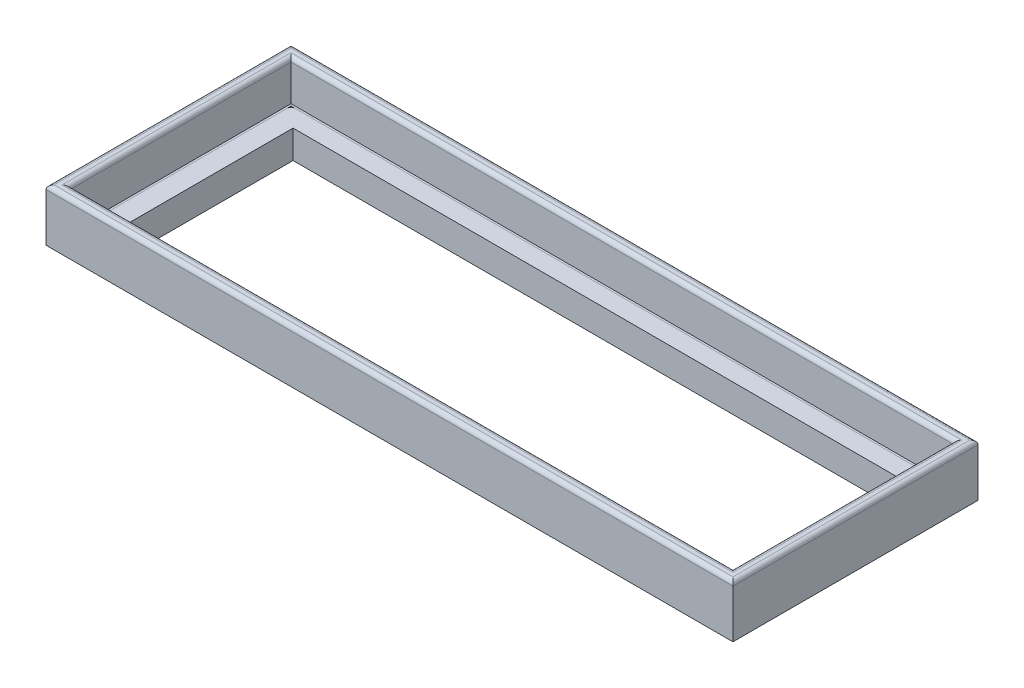
ISO-10303-21;
HEADER;
FILE_DESCRIPTION(('STEP AP214'),'2;1');
FILE_NAME('part.step','',(''),(''),'','','');
FILE_SCHEMA(('AUTOMOTIVE_DESIGN { 1 0 10303 214 1 1 1 1 }'));
ENDSEC;
DATA;
#1=APPLICATION_CONTEXT('core data for automotive mechanical design processes');
#2=APPLICATION_PROTOCOL_DEFINITION('international standard','automotive_design',2000,#1);
#3=PRODUCT_CONTEXT('',#1,'mechanical');
#4=PRODUCT('Part','Part','',(#3));
#5=PRODUCT_RELATED_PRODUCT_CATEGORY('part','',(#4));
#6=PRODUCT_DEFINITION_FORMATION('','',#4);
#7=PRODUCT_DEFINITION_CONTEXT('part definition',#1,'design');
#8=PRODUCT_DEFINITION('design','',#6,#7);
#9=PRODUCT_DEFINITION_SHAPE('','',#8);
#10=(LENGTH_UNIT() NAMED_UNIT(*) SI_UNIT(.MILLI.,.METRE.));
#11=(NAMED_UNIT(*) PLANE_ANGLE_UNIT() SI_UNIT($,.RADIAN.));
#12=(NAMED_UNIT(*) SI_UNIT($,.STERADIAN.) SOLID_ANGLE_UNIT());
#13=UNCERTAINTY_MEASURE_WITH_UNIT(LENGTH_MEASURE(1.E-05),#10,'distance_accuracy_value','');
#14=(GEOMETRIC_REPRESENTATION_CONTEXT(3) GLOBAL_UNCERTAINTY_ASSIGNED_CONTEXT((#13)) GLOBAL_UNIT_ASSIGNED_CONTEXT((#10,
#11,#12)) REPRESENTATION_CONTEXT('',''));
#15=CARTESIAN_POINT('',(0.,0.,0.));
#16=DIRECTION('',(0.,0.,1.));
#17=DIRECTION('',(1.,0.,0.));
#18=AXIS2_PLACEMENT_3D('',#15,#16,#17);
#19=CARTESIAN_POINT('',(-82.,-7.,27.));
#20=DIRECTION('',(1.,0.,0.));
#21=DIRECTION('',(0.,0.,-1.));
#22=AXIS2_PLACEMENT_3D('',#19,#20,#21);
#23=PLANE('',#22);
#24=DIRECTION('',(0.,1.,0.));
#25=VECTOR('',#24,1.);
#26=CARTESIAN_POINT('',(-82.,-7.,27.));
#27=LINE('',#26,#25);
#28=CARTESIAN_POINT('',(-82.,-6.,27.));
#29=VERTEX_POINT('',#28);
#30=CARTESIAN_POINT('',(-82.,-1.,27.));
#31=VERTEX_POINT('',#30);
#32=EDGE_CURVE('E194',#29,#31,#27,.T.);
#33=ORIENTED_EDGE('',*,*,#32,.T.);
#34=CARTESIAN_POINT('',(-82.,-1.,26.));
#35=DIRECTION('',(1.,0.,0.));
#36=DIRECTION('',(0.,0.,-1.));
#37=AXIS2_PLACEMENT_3D('',#34,#35,#36);
#38=CIRCLE('',#37,1.);
#39=CARTESIAN_POINT('',(-82.,0.,26.));
#40=VERTEX_POINT('',#39);
#41=EDGE_CURVE('E229',#31,#40,#38,.F.);
#42=ORIENTED_EDGE('',*,*,#41,.T.);
#43=DIRECTION('',(0.,0.,-1.));
#44=VECTOR('',#43,1.);
#45=CARTESIAN_POINT('',(-82.,0.,27.));
#46=LINE('',#45,#44);
#47=CARTESIAN_POINT('',(-82.,0.,-26.));
#48=VERTEX_POINT('',#47);
#49=EDGE_CURVE('E185',#40,#48,#46,.T.);
#50=ORIENTED_EDGE('',*,*,#49,.T.);
#51=DIRECTION('',(0.,1.,0.));
#52=VECTOR('',#51,1.);
#53=CARTESIAN_POINT('',(-82.,-7.,-26.));
#54=LINE('',#53,#52);
#55=CARTESIAN_POINT('',(-82.,-6.,-26.));
#56=VERTEX_POINT('',#55);
#57=EDGE_CURVE('E225',#48,#56,#54,.F.);
#58=ORIENTED_EDGE('',*,*,#57,.T.);
#59=DIRECTION('',(0.,0.,-1.));
#60=VECTOR('',#59,1.);
#61=CARTESIAN_POINT('',(-82.,-6.,27.));
#62=LINE('',#61,#60);
#63=EDGE_CURVE('E227',#56,#29,#62,.F.);
#64=ORIENTED_EDGE('',*,*,#63,.T.);
#65=EDGE_LOOP('',(#33,#42,#50,#58,#64));
#66=FACE_BOUND('',#65,.T.);
#67=ADVANCED_FACE('F49',(#66),#23,.F.);
#68=CARTESIAN_POINT('',(-82.,-7.,-27.));
#69=DIRECTION('',(0.,0.,1.));
#70=DIRECTION('',(1.,0.,0.));
#71=AXIS2_PLACEMENT_3D('',#68,#69,#70);
#72=PLANE('',#71);
#73=DIRECTION('',(1.,0.,0.));
#74=VECTOR('',#73,1.);
#75=CARTESIAN_POINT('',(-82.,0.,-27.));
#76=LINE('',#75,#74);
#77=CARTESIAN_POINT('',(-81.,0.,-27.));
#78=VERTEX_POINT('',#77);
#79=CARTESIAN_POINT('',(81.,0.,-27.));
#80=VERTEX_POINT('',#79);
#81=EDGE_CURVE('E188',#78,#80,#76,.T.);
#82=ORIENTED_EDGE('',*,*,#81,.T.);
#83=DIRECTION('',(0.,1.,0.));
#84=VECTOR('',#83,1.);
#85=CARTESIAN_POINT('',(81.,-7.,-27.));
#86=LINE('',#85,#84);
#87=CARTESIAN_POINT('',(81.,-6.,-27.));
#88=VERTEX_POINT('',#87);
#89=EDGE_CURVE('E223',#80,#88,#86,.F.);
#90=ORIENTED_EDGE('',*,*,#89,.T.);
#91=DIRECTION('',(1.,0.,0.));
#92=VECTOR('',#91,1.);
#93=CARTESIAN_POINT('',(-82.,-6.,-27.));
#94=LINE('',#93,#92);
#95=CARTESIAN_POINT('',(-81.,-6.,-27.));
#96=VERTEX_POINT('',#95);
#97=EDGE_CURVE('E221',#88,#96,#94,.F.);
#98=ORIENTED_EDGE('',*,*,#97,.T.);
#99=DIRECTION('',(0.,1.,0.));
#100=VECTOR('',#99,1.);
#101=CARTESIAN_POINT('',(-81.,-7.,-27.));
#102=LINE('',#101,#100);
#103=EDGE_CURVE('E219',#96,#78,#102,.T.);
#104=ORIENTED_EDGE('',*,*,#103,.T.);
#105=EDGE_LOOP('',(#82,#90,#98,#104));
#106=FACE_BOUND('',#105,.T.);
#107=ADVANCED_FACE('F283',(#106),#72,.F.);
#108=CARTESIAN_POINT('',(82.,-7.,27.));
#109=DIRECTION('',(1.,0.,0.));
#110=DIRECTION('',(0.,0.,-1.));
#111=AXIS2_PLACEMENT_3D('',#108,#109,#110);
#112=PLANE('',#111);
#113=DIRECTION('',(0.,0.,-1.));
#114=VECTOR('',#113,1.);
#115=CARTESIAN_POINT('',(82.,-6.,27.));
#116=LINE('',#115,#114);
#117=CARTESIAN_POINT('',(82.,-6.,26.));
#118=VERTEX_POINT('',#117);
#119=CARTESIAN_POINT('',(82.,-6.,-26.));
#120=VERTEX_POINT('',#119);
#121=EDGE_CURVE('E215',#118,#120,#116,.T.);
#122=ORIENTED_EDGE('',*,*,#121,.T.);
#123=DIRECTION('',(0.,1.,0.));
#124=VECTOR('',#123,1.);
#125=CARTESIAN_POINT('',(82.,0.,-26.));
#126=LINE('',#125,#124);
#127=CARTESIAN_POINT('',(82.,0.,-26.));
#128=VERTEX_POINT('',#127);
#129=EDGE_CURVE('E217',#120,#128,#126,.T.);
#130=ORIENTED_EDGE('',*,*,#129,.T.);
#131=DIRECTION('',(0.,0.,-1.));
#132=VECTOR('',#131,1.);
#133=CARTESIAN_POINT('',(82.,0.,27.));
#134=LINE('',#133,#132);
#135=CARTESIAN_POINT('',(82.,0.,26.));
#136=VERTEX_POINT('',#135);
#137=EDGE_CURVE('E191',#136,#128,#134,.T.);
#138=ORIENTED_EDGE('',*,*,#137,.F.);
#139=DIRECTION('',(0.,1.,0.));
#140=VECTOR('',#139,1.);
#141=CARTESIAN_POINT('',(82.,-7.,26.));
#142=LINE('',#141,#140);
#143=EDGE_CURVE('E213',#136,#118,#142,.F.);
#144=ORIENTED_EDGE('',*,*,#143,.T.);
#145=EDGE_LOOP('',(#122,#130,#138,#144));
#146=FACE_BOUND('',#145,.T.);
#147=ADVANCED_FACE('F306',(#146),#112,.T.);
#148=CARTESIAN_POINT('',(-82.,-7.,27.));
#149=DIRECTION('',(0.,0.,1.));
#150=DIRECTION('',(1.,0.,0.));
#151=AXIS2_PLACEMENT_3D('',#148,#149,#150);
#152=PLANE('',#151);
#153=ORIENTED_EDGE('',*,*,#32,.F.);
#154=DIRECTION('',(1.,0.,0.));
#155=VECTOR('',#154,1.);
#156=CARTESIAN_POINT('',(-82.,-6.,27.));
#157=LINE('',#156,#155);
#158=CARTESIAN_POINT('',(81.,-6.,27.));
#159=VERTEX_POINT('',#158);
#160=EDGE_CURVE('E201',#29,#159,#157,.T.);
#161=ORIENTED_EDGE('',*,*,#160,.T.);
#162=DIRECTION('',(0.,1.,0.));
#163=VECTOR('',#162,1.);
#164=CARTESIAN_POINT('',(81.,-7.,27.));
#165=LINE('',#164,#163);
#166=CARTESIAN_POINT('',(81.,-1.,27.));
#167=VERTEX_POINT('',#166);
#168=EDGE_CURVE('E199',#159,#167,#165,.T.);
#169=ORIENTED_EDGE('',*,*,#168,.T.);
#170=DIRECTION('',(1.,0.,0.));
#171=VECTOR('',#170,1.);
#172=CARTESIAN_POINT('',(-82.,-1.,27.));
#173=LINE('',#172,#171);
#174=EDGE_CURVE('E197',#167,#31,#173,.F.);
#175=ORIENTED_EDGE('',*,*,#174,.T.);
#176=EDGE_LOOP('',(#153,#161,#169,#175));
#177=FACE_BOUND('',#176,.T.);
#178=ADVANCED_FACE('F493',(#177),#152,.T.);
#179=CARTESIAN_POINT('',(0.,-7.,0.));
#180=DIRECTION('',(0.,-1.,0.));
#181=DIRECTION('',(0.,0.,-1.));
#182=AXIS2_PLACEMENT_3D('',#179,#180,#181);
#183=PLANE('',#182);
#184=DIRECTION('',(0.,0.,-1.));
#185=VECTOR('',#184,1.);
#186=CARTESIAN_POINT('',(77.0000000000001,-7.,22.5));
#187=LINE('',#186,#185);
#188=CARTESIAN_POINT('',(77.0000000000001,-7.,22.5));
#189=VERTEX_POINT('',#188);
#190=CARTESIAN_POINT('',(77.0000000000001,-7.,-22.5));
#191=VERTEX_POINT('',#190);
#192=EDGE_CURVE('E150',#189,#191,#187,.T.);
#193=ORIENTED_EDGE('',*,*,#192,.T.);
#194=DIRECTION('',(-1.,0.,0.));
#195=VECTOR('',#194,1.);
#196=CARTESIAN_POINT('',(-77.,-7.,-22.5));
#197=LINE('',#196,#195);
#198=CARTESIAN_POINT('',(-77.,-7.,-22.5));
#199=VERTEX_POINT('',#198);
#200=EDGE_CURVE('E159',#191,#199,#197,.T.);
#201=ORIENTED_EDGE('',*,*,#200,.T.);
#202=DIRECTION('',(0.,0.,1.));
#203=VECTOR('',#202,1.);
#204=CARTESIAN_POINT('',(-77.,-7.,22.5));
#205=LINE('',#204,#203);
#206=CARTESIAN_POINT('',(-77.,-7.,22.5));
#207=VERTEX_POINT('',#206);
#208=EDGE_CURVE('E66',#199,#207,#205,.T.);
#209=ORIENTED_EDGE('',*,*,#208,.T.);
#210=DIRECTION('',(1.,0.,0.));
#211=VECTOR('',#210,1.);
#212=CARTESIAN_POINT('',(-77.,-7.,22.5));
#213=LINE('',#212,#211);
#214=EDGE_CURVE('E156',#207,#189,#213,.T.);
#215=ORIENTED_EDGE('',*,*,#214,.T.);
#216=EDGE_LOOP('',(#193,#201,#209,#215));
#217=FACE_BOUND('',#216,.T.);
#218=DIRECTION('',(0.,0.,-1.));
#219=VECTOR('',#218,1.);
#220=CARTESIAN_POINT('',(81.,-7.,0.));
#221=LINE('',#220,#219);
#222=CARTESIAN_POINT('',(81.,-7.,-26.));
#223=VERTEX_POINT('',#222);
#224=CARTESIAN_POINT('',(81.,-7.,26.));
#225=VERTEX_POINT('',#224);
#226=EDGE_CURVE('E208',#223,#225,#221,.F.);
#227=ORIENTED_EDGE('',*,*,#226,.T.);
#228=DIRECTION('',(1.,0.,0.));
#229=VECTOR('',#228,1.);
#230=CARTESIAN_POINT('',(0.,-7.,26.));
#231=LINE('',#230,#229);
#232=CARTESIAN_POINT('',(-81.,-7.,26.));
#233=VERTEX_POINT('',#232);
#234=EDGE_CURVE('E210',#225,#233,#231,.F.);
#235=ORIENTED_EDGE('',*,*,#234,.T.);
#236=DIRECTION('',(0.,0.,-1.));
#237=VECTOR('',#236,1.);
#238=CARTESIAN_POINT('',(-81.,-7.,-27.));
#239=LINE('',#238,#237);
#240=CARTESIAN_POINT('',(-81.,-7.,-26.));
#241=VERTEX_POINT('',#240);
#242=EDGE_CURVE('E204',#233,#241,#239,.T.);
#243=ORIENTED_EDGE('',*,*,#242,.T.);
#244=DIRECTION('',(1.,0.,0.));
#245=VECTOR('',#244,1.);
#246=CARTESIAN_POINT('',(82.,-7.,-26.));
#247=LINE('',#246,#245);
#248=EDGE_CURVE('E206',#241,#223,#247,.T.);
#249=ORIENTED_EDGE('',*,*,#248,.T.);
#250=EDGE_LOOP('',(#227,#235,#243,#249));
#251=FACE_BOUND('',#250,.T.);
#252=ADVANCED_FACE('F163',(#217,#251),#183,.T.);
#253=CARTESIAN_POINT('',(0.,0.,0.));
#254=DIRECTION('',(0.,-1.,0.));
#255=DIRECTION('',(0.,0.,-1.));
#256=AXIS2_PLACEMENT_3D('',#253,#254,#255);
#257=PLANE('',#256);
#258=DIRECTION('',(-1.,0.,0.));
#259=VECTOR('',#258,1.);
#260=CARTESIAN_POINT('',(-77.,0.,-22.5));
#261=LINE('',#260,#259);
#262=CARTESIAN_POINT('',(77.0000000000001,0.,-22.5));
#263=VERTEX_POINT('',#262);
#264=CARTESIAN_POINT('',(-77.,0.,-22.5));
#265=VERTEX_POINT('',#264);
#266=EDGE_CURVE('E175',#263,#265,#261,.T.);
#267=ORIENTED_EDGE('',*,*,#266,.F.);
#268=DIRECTION('',(0.,0.,-1.));
#269=VECTOR('',#268,1.);
#270=CARTESIAN_POINT('',(77.0000000000001,0.,22.5));
#271=LINE('',#270,#269);
#272=CARTESIAN_POINT('',(77.0000000000001,0.,22.5));
#273=VERTEX_POINT('',#272);
#274=EDGE_CURVE('E74',#273,#263,#271,.T.);
#275=ORIENTED_EDGE('',*,*,#274,.F.);
#276=DIRECTION('',(1.,0.,0.));
#277=VECTOR('',#276,1.);
#278=CARTESIAN_POINT('',(-77.,0.,22.5));
#279=LINE('',#278,#277);
#280=CARTESIAN_POINT('',(-77.,0.,22.5));
#281=VERTEX_POINT('',#280);
#282=EDGE_CURVE('E166',#281,#273,#279,.T.);
#283=ORIENTED_EDGE('',*,*,#282,.F.);
#284=DIRECTION('',(0.,0.,1.));
#285=VECTOR('',#284,1.);
#286=CARTESIAN_POINT('',(-77.,0.,22.5));
#287=LINE('',#286,#285);
#288=EDGE_CURVE('E169',#265,#281,#287,.T.);
#289=ORIENTED_EDGE('',*,*,#288,.F.);
#290=EDGE_LOOP('',(#267,#275,#283,#289));
#291=FACE_BOUND('',#290,.T.);
#292=ORIENTED_EDGE('',*,*,#137,.T.);
#293=CARTESIAN_POINT('',(81.,0.,-26.));
#294=DIRECTION('',(0.,-1.,0.));
#295=DIRECTION('',(0.,0.,-1.));
#296=AXIS2_PLACEMENT_3D('',#293,#294,#295);
#297=CIRCLE('',#296,1.);
#298=EDGE_CURVE('E12',#128,#80,#297,.F.);
#299=ORIENTED_EDGE('',*,*,#298,.T.);
#300=ORIENTED_EDGE('',*,*,#81,.F.);
#301=CARTESIAN_POINT('',(-81.,0.,-26.));
#302=DIRECTION('',(0.,-1.,0.));
#303=DIRECTION('',(0.,0.,-1.));
#304=AXIS2_PLACEMENT_3D('',#301,#302,#303);
#305=CIRCLE('',#304,1.);
#306=EDGE_CURVE('E231',#78,#48,#305,.F.);
#307=ORIENTED_EDGE('',*,*,#306,.T.);
#308=ORIENTED_EDGE('',*,*,#49,.F.);
#309=DIRECTION('',(1.,0.,0.));
#310=VECTOR('',#309,1.);
#311=CARTESIAN_POINT('',(82.,0.,26.));
#312=LINE('',#311,#310);
#313=EDGE_CURVE('E58',#40,#136,#312,.T.);
#314=ORIENTED_EDGE('',*,*,#313,.T.);
#315=EDGE_LOOP('',(#292,#299,#300,#307,#308,#314));
#316=FACE_BOUND('',#315,.T.);
#317=ADVANCED_FACE('F293',(#291,#316),#257,.F.);
#318=CARTESIAN_POINT('',(81.,-7.,-26.));
#319=DIRECTION('',(0.,-1.,0.));
#320=DIRECTION('',(0.,0.,-1.));
#321=AXIS2_PLACEMENT_3D('',#318,#319,#320);
#322=CYLINDRICAL_SURFACE('',#321,1.);
#323=ORIENTED_EDGE('',*,*,#298,.F.);
#324=ORIENTED_EDGE('',*,*,#129,.F.);
#325=CARTESIAN_POINT('',(81.,-6.,-26.));
#326=DIRECTION('',(0.,-1.,0.));
#327=DIRECTION('',(0.,0.,-1.));
#328=AXIS2_PLACEMENT_3D('',#325,#326,#327);
#329=CIRCLE('',#328,1.);
#330=EDGE_CURVE('E53',#88,#120,#329,.T.);
#331=ORIENTED_EDGE('',*,*,#330,.F.);
#332=ORIENTED_EDGE('',*,*,#89,.F.);
#333=EDGE_LOOP('',(#323,#324,#331,#332));
#334=FACE_BOUND('',#333,.T.);
#335=ADVANCED_FACE('F51',(#334),#322,.T.);
#336=CARTESIAN_POINT('',(0.,-6.,-26.));
#337=DIRECTION('',(-1.,0.,0.));
#338=DIRECTION('',(0.,0.,1.));
#339=AXIS2_PLACEMENT_3D('',#336,#337,#338);
#340=CYLINDRICAL_SURFACE('',#339,1.);
#341=CARTESIAN_POINT('',(-81.,-6.,-26.));
#342=DIRECTION('',(-1.,0.,0.));
#343=DIRECTION('',(0.,0.,1.));
#344=AXIS2_PLACEMENT_3D('',#341,#342,#343);
#345=CIRCLE('',#344,1.);
#346=EDGE_CURVE('E255',#96,#241,#345,.T.);
#347=ORIENTED_EDGE('',*,*,#346,.F.);
#348=ORIENTED_EDGE('',*,*,#97,.F.);
#349=CARTESIAN_POINT('',(81.,-6.,-26.));
#350=DIRECTION('',(1.,0.,0.));
#351=DIRECTION('',(0.,0.,-1.));
#352=AXIS2_PLACEMENT_3D('',#349,#350,#351);
#353=CIRCLE('',#352,1.);
#354=EDGE_CURVE('E257',#223,#88,#353,.T.);
#355=ORIENTED_EDGE('',*,*,#354,.F.);
#356=ORIENTED_EDGE('',*,*,#248,.F.);
#357=EDGE_LOOP('',(#347,#348,#355,#356));
#358=FACE_BOUND('',#357,.T.);
#359=ADVANCED_FACE('F280',(#358),#340,.T.);
#360=CARTESIAN_POINT('',(-81.,-7.,-26.));
#361=DIRECTION('',(0.,1.,0.));
#362=DIRECTION('',(0.,0.,1.));
#363=AXIS2_PLACEMENT_3D('',#360,#361,#362);
#364=CYLINDRICAL_SURFACE('',#363,1.);
#365=ORIENTED_EDGE('',*,*,#306,.F.);
#366=ORIENTED_EDGE('',*,*,#103,.F.);
#367=CARTESIAN_POINT('',(-81.,-6.,-26.));
#368=DIRECTION('',(0.,-1.,0.));
#369=DIRECTION('',(0.,0.,-1.));
#370=AXIS2_PLACEMENT_3D('',#367,#368,#369);
#371=CIRCLE('',#370,1.);
#372=EDGE_CURVE('E252',#56,#96,#371,.T.);
#373=ORIENTED_EDGE('',*,*,#372,.F.);
#374=ORIENTED_EDGE('',*,*,#57,.F.);
#375=EDGE_LOOP('',(#365,#366,#373,#374));
#376=FACE_BOUND('',#375,.T.);
#377=ADVANCED_FACE('F288',(#376),#364,.T.);
#378=CARTESIAN_POINT('',(0.,-1.,26.));
#379=DIRECTION('',(-1.,0.,0.));
#380=DIRECTION('',(0.,0.,1.));
#381=AXIS2_PLACEMENT_3D('',#378,#379,#380);
#382=CYLINDRICAL_SURFACE('',#381,1.);
#383=ORIENTED_EDGE('',*,*,#41,.F.);
#384=ORIENTED_EDGE('',*,*,#174,.F.);
#385=CARTESIAN_POINT('',(81.,-1.,26.));
#386=DIRECTION('',(-0.707106781186547,0.707106781186547,0.));
#387=DIRECTION('',(-0.707106781186547,-0.707106781186547,0.));
#388=AXIS2_PLACEMENT_3D('',#385,#386,#387);
#389=ELLIPSE('',#388,1.41421356237309,1.);
#390=EDGE_CURVE('E249',#136,#167,#389,.F.);
#391=ORIENTED_EDGE('',*,*,#390,.F.);
#392=ORIENTED_EDGE('',*,*,#313,.F.);
#393=EDGE_LOOP('',(#383,#384,#391,#392));
#394=FACE_BOUND('',#393,.T.);
#395=ADVANCED_FACE('F300',(#394),#382,.T.);
#396=CARTESIAN_POINT('',(81.,-6.,-26.));
#397=DIRECTION('',(0.,0.,-1.));
#398=DIRECTION('',(-1.,0.,0.));
#399=AXIS2_PLACEMENT_3D('',#396,#397,#398);
#400=SPHERICAL_SURFACE('',#399,1.);
#401=ORIENTED_EDGE('',*,*,#354,.T.);
#402=ORIENTED_EDGE('',*,*,#330,.T.);
#403=CARTESIAN_POINT('',(81.,-6.,-26.));
#404=DIRECTION('',(0.,0.,-1.));
#405=DIRECTION('',(-1.,0.,0.));
#406=AXIS2_PLACEMENT_3D('',#403,#404,#405);
#407=CIRCLE('',#406,1.);
#408=EDGE_CURVE('E246',#223,#120,#407,.F.);
#409=ORIENTED_EDGE('',*,*,#408,.F.);
#410=EDGE_LOOP('',(#401,#402,#409));
#411=FACE_BOUND('',#410,.T.);
#412=ADVANCED_FACE('F264',(#411),#400,.T.);
#413=CARTESIAN_POINT('',(-81.,-6.,-26.));
#414=DIRECTION('',(0.,0.,-1.));
#415=DIRECTION('',(-1.,0.,0.));
#416=AXIS2_PLACEMENT_3D('',#413,#414,#415);
#417=SPHERICAL_SURFACE('',#416,1.);
#418=ORIENTED_EDGE('',*,*,#372,.T.);
#419=ORIENTED_EDGE('',*,*,#346,.T.);
#420=CARTESIAN_POINT('',(-81.,-6.,-26.));
#421=DIRECTION('',(0.,0.,-1.));
#422=DIRECTION('',(-1.,0.,0.));
#423=AXIS2_PLACEMENT_3D('',#420,#421,#422);
#424=CIRCLE('',#423,1.);
#425=EDGE_CURVE('E243',#56,#241,#424,.F.);
#426=ORIENTED_EDGE('',*,*,#425,.F.);
#427=EDGE_LOOP('',(#418,#419,#426));
#428=FACE_BOUND('',#427,.T.);
#429=ADVANCED_FACE('F339',(#428),#417,.T.);
#430=CARTESIAN_POINT('',(81.,-7.,26.));
#431=DIRECTION('',(0.,1.,0.));
#432=DIRECTION('',(0.,0.,1.));
#433=AXIS2_PLACEMENT_3D('',#430,#431,#432);
#434=CYLINDRICAL_SURFACE('',#433,1.);
#435=ORIENTED_EDGE('',*,*,#390,.T.);
#436=ORIENTED_EDGE('',*,*,#168,.F.);
#437=CARTESIAN_POINT('',(81.,-6.,26.));
#438=DIRECTION('',(0.,-1.,0.));
#439=DIRECTION('',(0.,0.,-1.));
#440=AXIS2_PLACEMENT_3D('',#437,#438,#439);
#441=CIRCLE('',#440,1.);
#442=EDGE_CURVE('E240',#118,#159,#441,.T.);
#443=ORIENTED_EDGE('',*,*,#442,.F.);
#444=ORIENTED_EDGE('',*,*,#143,.F.);
#445=EDGE_LOOP('',(#435,#436,#443,#444));
#446=FACE_BOUND('',#445,.T.);
#447=ADVANCED_FACE('F336',(#446),#434,.T.);
#448=CARTESIAN_POINT('',(81.,-6.,27.));
#449=DIRECTION('',(0.,0.,-1.));
#450=DIRECTION('',(-1.,0.,0.));
#451=AXIS2_PLACEMENT_3D('',#448,#449,#450);
#452=CYLINDRICAL_SURFACE('',#451,1.);
#453=ORIENTED_EDGE('',*,*,#408,.T.);
#454=ORIENTED_EDGE('',*,*,#121,.F.);
#455=CARTESIAN_POINT('',(81.,-6.,26.));
#456=DIRECTION('',(0.,0.,1.));
#457=DIRECTION('',(1.,0.,0.));
#458=AXIS2_PLACEMENT_3D('',#455,#456,#457);
#459=CIRCLE('',#458,1.);
#460=EDGE_CURVE('E237',#225,#118,#459,.T.);
#461=ORIENTED_EDGE('',*,*,#460,.F.);
#462=ORIENTED_EDGE('',*,*,#226,.F.);
#463=EDGE_LOOP('',(#453,#454,#461,#462));
#464=FACE_BOUND('',#463,.T.);
#465=ADVANCED_FACE('F271',(#464),#452,.T.);
#466=CARTESIAN_POINT('',(-81.,-6.,0.));
#467=DIRECTION('',(0.,0.,1.));
#468=DIRECTION('',(1.,0.,0.));
#469=AXIS2_PLACEMENT_3D('',#466,#467,#468);
#470=CYLINDRICAL_SURFACE('',#469,1.);
#471=ORIENTED_EDGE('',*,*,#425,.T.);
#472=ORIENTED_EDGE('',*,*,#242,.F.);
#473=CARTESIAN_POINT('',(-81.,-6.,26.));
#474=DIRECTION('',(0.707106781186547,0.,0.707106781186547));
#475=DIRECTION('',(-0.707106781186547,0.,0.707106781186547));
#476=AXIS2_PLACEMENT_3D('',#473,#474,#475);
#477=ELLIPSE('',#476,1.41421356237309,1.);
#478=EDGE_CURVE('E235',#29,#233,#477,.T.);
#479=ORIENTED_EDGE('',*,*,#478,.F.);
#480=ORIENTED_EDGE('',*,*,#63,.F.);
#481=EDGE_LOOP('',(#471,#472,#479,#480));
#482=FACE_BOUND('',#481,.T.);
#483=ADVANCED_FACE('F329',(#482),#470,.T.);
#484=CARTESIAN_POINT('',(81.,-6.,26.));
#485=DIRECTION('',(1.,0.,0.));
#486=DIRECTION('',(0.,0.,-1.));
#487=AXIS2_PLACEMENT_3D('',#484,#485,#486);
#488=SPHERICAL_SURFACE('',#487,1.);
#489=ORIENTED_EDGE('',*,*,#460,.T.);
#490=ORIENTED_EDGE('',*,*,#442,.T.);
#491=CARTESIAN_POINT('',(81.,-6.,26.));
#492=DIRECTION('',(1.,0.,0.));
#493=DIRECTION('',(0.,0.,-1.));
#494=AXIS2_PLACEMENT_3D('',#491,#492,#493);
#495=CIRCLE('',#494,1.);
#496=EDGE_CURVE('E181',#225,#159,#495,.F.);
#497=ORIENTED_EDGE('',*,*,#496,.F.);
#498=EDGE_LOOP('',(#489,#490,#497));
#499=FACE_BOUND('',#498,.T.);
#500=ADVANCED_FACE('F325',(#499),#488,.T.);
#501=CARTESIAN_POINT('',(-82.,-6.,26.));
#502=DIRECTION('',(1.,0.,0.));
#503=DIRECTION('',(0.,0.,-1.));
#504=AXIS2_PLACEMENT_3D('',#501,#502,#503);
#505=CYLINDRICAL_SURFACE('',#504,1.);
#506=ORIENTED_EDGE('',*,*,#478,.T.);
#507=ORIENTED_EDGE('',*,*,#234,.F.);
#508=ORIENTED_EDGE('',*,*,#496,.T.);
#509=ORIENTED_EDGE('',*,*,#160,.F.);
#510=EDGE_LOOP('',(#506,#507,#508,#509));
#511=FACE_BOUND('',#510,.T.);
#512=ADVANCED_FACE('F322',(#511),#505,.T.);
#513=CARTESIAN_POINT('',(77.0000000000001,-7.,22.5));
#514=DIRECTION('',(1.,0.,0.));
#515=DIRECTION('',(0.,0.,-1.));
#516=AXIS2_PLACEMENT_3D('',#513,#514,#515);
#517=PLANE('',#516);
#518=ORIENTED_EDGE('',*,*,#274,.T.);
#519=DIRECTION('',(0.,1.,0.));
#520=VECTOR('',#519,1.);
#521=CARTESIAN_POINT('',(77.0000000000001,-7.,-22.5));
#522=LINE('',#521,#520);
#523=EDGE_CURVE('E146',#191,#263,#522,.T.);
#524=ORIENTED_EDGE('',*,*,#523,.F.);
#525=ORIENTED_EDGE('',*,*,#192,.F.);
#526=DIRECTION('',(0.,1.,0.));
#527=VECTOR('',#526,1.);
#528=CARTESIAN_POINT('',(77.0000000000001,-7.,22.5));
#529=LINE('',#528,#527);
#530=EDGE_CURVE('E179',#189,#273,#529,.T.);
#531=ORIENTED_EDGE('',*,*,#530,.T.);
#532=EDGE_LOOP('',(#518,#524,#525,#531));
#533=FACE_BOUND('',#532,.T.);
#534=ADVANCED_FACE('F148',(#533),#517,.F.);
#535=CARTESIAN_POINT('',(-77.,-7.,22.5));
#536=DIRECTION('',(0.,0.,1.));
#537=DIRECTION('',(1.,0.,0.));
#538=AXIS2_PLACEMENT_3D('',#535,#536,#537);
#539=PLANE('',#538);
#540=ORIENTED_EDGE('',*,*,#282,.T.);
#541=ORIENTED_EDGE('',*,*,#530,.F.);
#542=ORIENTED_EDGE('',*,*,#214,.F.);
#543=DIRECTION('',(0.,1.,0.));
#544=VECTOR('',#543,1.);
#545=CARTESIAN_POINT('',(-77.,-7.,22.5));
#546=LINE('',#545,#544);
#547=EDGE_CURVE('E182',#207,#281,#546,.T.);
#548=ORIENTED_EDGE('',*,*,#547,.T.);
#549=EDGE_LOOP('',(#540,#541,#542,#548));
#550=FACE_BOUND('',#549,.T.);
#551=ADVANCED_FACE('F392',(#550),#539,.F.);
#552=CARTESIAN_POINT('',(-77.,-7.,22.5));
#553=DIRECTION('',(-1.,0.,0.));
#554=DIRECTION('',(0.,0.,1.));
#555=AXIS2_PLACEMENT_3D('',#552,#553,#554);
#556=PLANE('',#555);
#557=ORIENTED_EDGE('',*,*,#288,.T.);
#558=ORIENTED_EDGE('',*,*,#547,.F.);
#559=ORIENTED_EDGE('',*,*,#208,.F.);
#560=DIRECTION('',(0.,1.,0.));
#561=VECTOR('',#560,1.);
#562=CARTESIAN_POINT('',(-77.,-7.,-22.5));
#563=LINE('',#562,#561);
#564=EDGE_CURVE('E155',#199,#265,#563,.T.);
#565=ORIENTED_EDGE('',*,*,#564,.T.);
#566=EDGE_LOOP('',(#557,#558,#559,#565));
#567=FACE_BOUND('',#566,.T.);
#568=ADVANCED_FACE('F400',(#567),#556,.F.);
#569=CARTESIAN_POINT('',(-77.,-7.,-22.5));
#570=DIRECTION('',(0.,0.,-1.));
#571=DIRECTION('',(-1.,0.,0.));
#572=AXIS2_PLACEMENT_3D('',#569,#570,#571);
#573=PLANE('',#572);
#574=ORIENTED_EDGE('',*,*,#266,.T.);
#575=ORIENTED_EDGE('',*,*,#564,.F.);
#576=ORIENTED_EDGE('',*,*,#200,.F.);
#577=ORIENTED_EDGE('',*,*,#523,.T.);
#578=EDGE_LOOP('',(#574,#575,#576,#577));
#579=FACE_BOUND('',#578,.T.);
#580=ADVANCED_FACE('F160',(#579),#573,.F.);
#581=CLOSED_SHELL('',(#67,#107,#147,#178,#252,#317,#335,#359,#377,#395,#412,#429,#447,#465,#483,
#500,#512,#534,#551,#568,#580));
#582=MANIFOLD_SOLID_BREP('B2',#581);
#583=CARTESIAN_POINT('',(82.5,10.,0.));
#584=DIRECTION('',(-1.,0.,0.));
#585=DIRECTION('',(0.,0.,1.));
#586=AXIS2_PLACEMENT_3D('',#583,#584,#585);
#587=PLANE('',#586);
#588=DIRECTION('',(0.,-1.,0.));
#589=VECTOR('',#588,1.);
#590=CARTESIAN_POINT('',(82.5,10.,27.5));
#591=LINE('',#590,#589);
#592=CARTESIAN_POINT('',(82.5,9.,27.5));
#593=VERTEX_POINT('',#592);
#594=CARTESIAN_POINT('',(82.5,0.,27.5));
#595=VERTEX_POINT('',#594);
#596=EDGE_CURVE('E732',#593,#595,#591,.T.);
#597=ORIENTED_EDGE('',*,*,#596,.F.);
#598=DIRECTION('',(0.,0.,-1.));
#599=VECTOR('',#598,1.);
#600=CARTESIAN_POINT('',(82.5,9.,0.));
#601=LINE('',#600,#599);
#602=CARTESIAN_POINT('',(82.5,9.,-27.5));
#603=VERTEX_POINT('',#602);
#604=EDGE_CURVE('E763',#593,#603,#601,.T.);
#605=ORIENTED_EDGE('',*,*,#604,.T.);
#606=DIRECTION('',(0.,-1.,0.));
#607=VECTOR('',#606,1.);
#608=CARTESIAN_POINT('',(82.5,10.,-27.5));
#609=LINE('',#608,#607);
#610=CARTESIAN_POINT('',(82.5,0.,-27.5));
#611=VERTEX_POINT('',#610);
#612=EDGE_CURVE('E660',#603,#611,#609,.T.);
#613=ORIENTED_EDGE('',*,*,#612,.T.);
#614=DIRECTION('',(0.,0.,-1.));
#615=VECTOR('',#614,1.);
#616=CARTESIAN_POINT('',(82.5,0.,0.));
#617=LINE('',#616,#615);
#618=EDGE_CURVE('E710',#595,#611,#617,.T.);
#619=ORIENTED_EDGE('',*,*,#618,.F.);
#620=EDGE_LOOP('',(#597,#605,#613,#619));
#621=FACE_BOUND('',#620,.T.);
#622=ADVANCED_FACE('F541',(#621),#587,.T.);
#623=CARTESIAN_POINT('',(0.,10.,27.5));
#624=DIRECTION('',(0.,0.,-1.));
#625=DIRECTION('',(-1.,0.,0.));
#626=AXIS2_PLACEMENT_3D('',#623,#624,#625);
#627=PLANE('',#626);
#628=DIRECTION('',(0.,-1.,0.));
#629=VECTOR('',#628,1.);
#630=CARTESIAN_POINT('',(-82.5,10.,27.5));
#631=LINE('',#630,#629);
#632=CARTESIAN_POINT('',(-82.5,9.,27.5));
#633=VERTEX_POINT('',#632);
#634=CARTESIAN_POINT('',(-82.5,0.,27.5));
#635=VERTEX_POINT('',#634);
#636=EDGE_CURVE('E730',#633,#635,#631,.T.);
#637=ORIENTED_EDGE('',*,*,#636,.F.);
#638=DIRECTION('',(1.,0.,0.));
#639=VECTOR('',#638,1.);
#640=CARTESIAN_POINT('',(0.,9.,27.5));
#641=LINE('',#640,#639);
#642=EDGE_CURVE('E761',#633,#593,#641,.T.);
#643=ORIENTED_EDGE('',*,*,#642,.T.);
#644=ORIENTED_EDGE('',*,*,#596,.T.);
#645=DIRECTION('',(1.,0.,0.));
#646=VECTOR('',#645,1.);
#647=CARTESIAN_POINT('',(0.,0.,27.5));
#648=LINE('',#647,#646);
#649=EDGE_CURVE('E718',#635,#595,#648,.T.);
#650=ORIENTED_EDGE('',*,*,#649,.F.);
#651=EDGE_LOOP('',(#637,#643,#644,#650));
#652=FACE_BOUND('',#651,.T.);
#653=ADVANCED_FACE('F816',(#652),#627,.T.);
#654=CARTESIAN_POINT('',(-82.5,10.,0.));
#655=DIRECTION('',(-1.,0.,0.));
#656=DIRECTION('',(0.,0.,1.));
#657=AXIS2_PLACEMENT_3D('',#654,#655,#656);
#658=PLANE('',#657);
#659=DIRECTION('',(0.,-1.,0.));
#660=VECTOR('',#659,1.);
#661=CARTESIAN_POINT('',(-82.5,10.,-27.5));
#662=LINE('',#661,#660);
#663=CARTESIAN_POINT('',(-82.5,9.,-27.5));
#664=VERTEX_POINT('',#663);
#665=CARTESIAN_POINT('',(-82.5,0.,-27.5));
#666=VERTEX_POINT('',#665);
#667=EDGE_CURVE('E728',#664,#666,#662,.T.);
#668=ORIENTED_EDGE('',*,*,#667,.F.);
#669=DIRECTION('',(0.,0.,-1.));
#670=VECTOR('',#669,1.);
#671=CARTESIAN_POINT('',(-82.5,9.,27.5));
#672=LINE('',#671,#670);
#673=EDGE_CURVE('E759',#664,#633,#672,.F.);
#674=ORIENTED_EDGE('',*,*,#673,.T.);
#675=ORIENTED_EDGE('',*,*,#636,.T.);
#676=DIRECTION('',(0.,0.,-1.));
#677=VECTOR('',#676,1.);
#678=CARTESIAN_POINT('',(-82.5,0.,0.));
#679=LINE('',#678,#677);
#680=EDGE_CURVE('E721',#635,#666,#679,.T.);
#681=ORIENTED_EDGE('',*,*,#680,.T.);
#682=EDGE_LOOP('',(#668,#674,#675,#681));
#683=FACE_BOUND('',#682,.T.);
#684=ADVANCED_FACE('F822',(#683),#658,.F.);
#685=CARTESIAN_POINT('',(-85.5,10.,0.));
#686=DIRECTION('',(-1.,0.,0.));
#687=DIRECTION('',(0.,0.,1.));
#688=AXIS2_PLACEMENT_3D('',#685,#686,#687);
#689=PLANE('',#688);
#690=DIRECTION('',(0.,-1.,0.));
#691=VECTOR('',#690,1.);
#692=CARTESIAN_POINT('',(-85.5,10.,30.5));
#693=LINE('',#692,#691);
#694=CARTESIAN_POINT('',(-85.5,9.,30.5));
#695=VERTEX_POINT('',#694);
#696=CARTESIAN_POINT('',(-85.5,-3.,30.5));
#697=VERTEX_POINT('',#696);
#698=EDGE_CURVE('E653',#695,#697,#693,.T.);
#699=ORIENTED_EDGE('',*,*,#698,.F.);
#700=DIRECTION('',(0.,0.,-1.));
#701=VECTOR('',#700,1.);
#702=CARTESIAN_POINT('',(-85.5,9.,0.));
#703=LINE('',#702,#701);
#704=CARTESIAN_POINT('',(-85.5,9.,-30.5));
#705=VERTEX_POINT('',#704);
#706=EDGE_CURVE('E47',#695,#705,#703,.T.);
#707=ORIENTED_EDGE('',*,*,#706,.T.);
#708=DIRECTION('',(0.,-1.,0.));
#709=VECTOR('',#708,1.);
#710=CARTESIAN_POINT('',(-85.5,10.,-30.5));
#711=LINE('',#710,#709);
#712=CARTESIAN_POINT('',(-85.5,-3.,-30.5));
#713=VERTEX_POINT('',#712);
#714=EDGE_CURVE('E667',#705,#713,#711,.T.);
#715=ORIENTED_EDGE('',*,*,#714,.T.);
#716=DIRECTION('',(0.,0.,-1.));
#717=VECTOR('',#716,1.);
#718=CARTESIAN_POINT('',(-85.5,-3.,0.));
#719=LINE('',#718,#717);
#720=EDGE_CURVE('E664',#697,#713,#719,.T.);
#721=ORIENTED_EDGE('',*,*,#720,.F.);
#722=EDGE_LOOP('',(#699,#707,#715,#721));
#723=FACE_BOUND('',#722,.T.);
#724=ADVANCED_FACE('F665',(#723),#689,.T.);
#725=CARTESIAN_POINT('',(0.,10.,30.5));
#726=DIRECTION('',(0.,0.,-1.));
#727=DIRECTION('',(-1.,0.,0.));
#728=AXIS2_PLACEMENT_3D('',#725,#726,#727);
#729=PLANE('',#728);
#730=DIRECTION('',(0.,-1.,0.));
#731=VECTOR('',#730,1.);
#732=CARTESIAN_POINT('',(85.5,10.,30.5));
#733=LINE('',#732,#731);
#734=CARTESIAN_POINT('',(85.5,9.,30.5));
#735=VERTEX_POINT('',#734);
#736=CARTESIAN_POINT('',(85.5,-3.,30.5));
#737=VERTEX_POINT('',#736);
#738=EDGE_CURVE('E661',#735,#737,#733,.T.);
#739=ORIENTED_EDGE('',*,*,#738,.F.);
#740=DIRECTION('',(1.,0.,0.));
#741=VECTOR('',#740,1.);
#742=CARTESIAN_POINT('',(-85.5,9.,30.5));
#743=LINE('',#742,#741);
#744=EDGE_CURVE('E550',#735,#695,#743,.F.);
#745=ORIENTED_EDGE('',*,*,#744,.T.);
#746=ORIENTED_EDGE('',*,*,#698,.T.);
#747=DIRECTION('',(1.,0.,0.));
#748=VECTOR('',#747,1.);
#749=CARTESIAN_POINT('',(0.,-3.,30.5));
#750=LINE('',#749,#748);
#751=EDGE_CURVE('E657',#697,#737,#750,.T.);
#752=ORIENTED_EDGE('',*,*,#751,.T.);
#753=EDGE_LOOP('',(#739,#745,#746,#752));
#754=FACE_BOUND('',#753,.T.);
#755=ADVANCED_FACE('F655',(#754),#729,.F.);
#756=CARTESIAN_POINT('',(85.5,10.,0.));
#757=DIRECTION('',(-1.,0.,0.));
#758=DIRECTION('',(0.,0.,1.));
#759=AXIS2_PLACEMENT_3D('',#756,#757,#758);
#760=PLANE('',#759);
#761=DIRECTION('',(0.,-1.,0.));
#762=VECTOR('',#761,1.);
#763=CARTESIAN_POINT('',(85.5,10.,-30.5));
#764=LINE('',#763,#762);
#765=CARTESIAN_POINT('',(85.5,9.,-30.5));
#766=VERTEX_POINT('',#765);
#767=CARTESIAN_POINT('',(85.5,-3.,-30.5));
#768=VERTEX_POINT('',#767);
#769=EDGE_CURVE('E736',#766,#768,#764,.T.);
#770=ORIENTED_EDGE('',*,*,#769,.F.);
#771=DIRECTION('',(0.,0.,-1.));
#772=VECTOR('',#771,1.);
#773=CARTESIAN_POINT('',(85.5,9.,30.5));
#774=LINE('',#773,#772);
#775=EDGE_CURVE('E565',#766,#735,#774,.F.);
#776=ORIENTED_EDGE('',*,*,#775,.T.);
#777=ORIENTED_EDGE('',*,*,#738,.T.);
#778=DIRECTION('',(0.,0.,-1.));
#779=VECTOR('',#778,1.);
#780=CARTESIAN_POINT('',(85.5,-3.,0.));
#781=LINE('',#780,#779);
#782=EDGE_CURVE('E677',#737,#768,#781,.T.);
#783=ORIENTED_EDGE('',*,*,#782,.T.);
#784=EDGE_LOOP('',(#770,#776,#777,#783));
#785=FACE_BOUND('',#784,.T.);
#786=ADVANCED_FACE('F805',(#785),#760,.F.);
#787=CARTESIAN_POINT('',(0.,10.,-30.5));
#788=DIRECTION('',(0.,0.,-1.));
#789=DIRECTION('',(-1.,0.,0.));
#790=AXIS2_PLACEMENT_3D('',#787,#788,#789);
#791=PLANE('',#790);
#792=ORIENTED_EDGE('',*,*,#714,.F.);
#793=DIRECTION('',(1.,0.,0.));
#794=VECTOR('',#793,1.);
#795=CARTESIAN_POINT('',(0.,9.,-30.5));
#796=LINE('',#795,#794);
#797=EDGE_CURVE('E765',#705,#766,#796,.T.);
#798=ORIENTED_EDGE('',*,*,#797,.T.);
#799=ORIENTED_EDGE('',*,*,#769,.T.);
#800=DIRECTION('',(1.,0.,0.));
#801=VECTOR('',#800,1.);
#802=CARTESIAN_POINT('',(0.,-3.,-30.5));
#803=LINE('',#802,#801);
#804=EDGE_CURVE('E679',#713,#768,#803,.T.);
#805=ORIENTED_EDGE('',*,*,#804,.F.);
#806=EDGE_LOOP('',(#792,#798,#799,#805));
#807=FACE_BOUND('',#806,.T.);
#808=ADVANCED_FACE('F804',(#807),#791,.T.);
#809=CARTESIAN_POINT('',(0.,10.,-27.5));
#810=DIRECTION('',(0.,0.,-1.));
#811=DIRECTION('',(-1.,0.,0.));
#812=AXIS2_PLACEMENT_3D('',#809,#810,#811);
#813=PLANE('',#812);
#814=ORIENTED_EDGE('',*,*,#612,.F.);
#815=DIRECTION('',(1.,0.,0.));
#816=VECTOR('',#815,1.);
#817=CARTESIAN_POINT('',(-82.5,9.,-27.5));
#818=LINE('',#817,#816);
#819=EDGE_CURVE('E756',#603,#664,#818,.F.);
#820=ORIENTED_EDGE('',*,*,#819,.T.);
#821=ORIENTED_EDGE('',*,*,#667,.T.);
#822=DIRECTION('',(1.,0.,0.));
#823=VECTOR('',#822,1.);
#824=CARTESIAN_POINT('',(0.,0.,-27.5));
#825=LINE('',#824,#823);
#826=EDGE_CURVE('E724',#666,#611,#825,.T.);
#827=ORIENTED_EDGE('',*,*,#826,.T.);
#828=EDGE_LOOP('',(#814,#820,#821,#827));
#829=FACE_BOUND('',#828,.T.);
#830=ADVANCED_FACE('F812',(#829),#813,.F.);
#831=CARTESIAN_POINT('',(0.,10.,0.));
#832=DIRECTION('',(0.,1.,0.));
#833=DIRECTION('',(0.,0.,1.));
#834=AXIS2_PLACEMENT_3D('',#831,#832,#833);
#835=PLANE('',#834);
#836=DIRECTION('',(0.,0.,-1.));
#837=VECTOR('',#836,1.);
#838=CARTESIAN_POINT('',(-83.5,10.,-27.5));
#839=LINE('',#838,#837);
#840=CARTESIAN_POINT('',(-83.5,10.,28.5));
#841=VERTEX_POINT('',#840);
#842=CARTESIAN_POINT('',(-83.5,10.,-28.5));
#843=VERTEX_POINT('',#842);
#844=EDGE_CURVE('E751',#841,#843,#839,.T.);
#845=ORIENTED_EDGE('',*,*,#844,.T.);
#846=DIRECTION('',(1.,0.,0.));
#847=VECTOR('',#846,1.);
#848=CARTESIAN_POINT('',(82.5,10.,-28.5));
#849=LINE('',#848,#847);
#850=CARTESIAN_POINT('',(83.5,10.,-28.5));
#851=VERTEX_POINT('',#850);
#852=EDGE_CURVE('E753',#843,#851,#849,.T.);
#853=ORIENTED_EDGE('',*,*,#852,.T.);
#854=DIRECTION('',(0.,0.,-1.));
#855=VECTOR('',#854,1.);
#856=CARTESIAN_POINT('',(83.5,10.,0.));
#857=LINE('',#856,#855);
#858=CARTESIAN_POINT('',(83.5,10.,28.5));
#859=VERTEX_POINT('',#858);
#860=EDGE_CURVE('E747',#851,#859,#857,.F.);
#861=ORIENTED_EDGE('',*,*,#860,.T.);
#862=DIRECTION('',(1.,0.,0.));
#863=VECTOR('',#862,1.);
#864=CARTESIAN_POINT('',(0.,10.,28.5));
#865=LINE('',#864,#863);
#866=EDGE_CURVE('E749',#859,#841,#865,.F.);
#867=ORIENTED_EDGE('',*,*,#866,.T.);
#868=EDGE_LOOP('',(#845,#853,#861,#867));
#869=FACE_BOUND('',#868,.T.);
#870=DIRECTION('',(0.,0.,-1.));
#871=VECTOR('',#870,1.);
#872=CARTESIAN_POINT('',(84.5,10.,-30.5));
#873=LINE('',#872,#871);
#874=CARTESIAN_POINT('',(84.5,10.,29.5));
#875=VERTEX_POINT('',#874);
#876=CARTESIAN_POINT('',(84.5,10.,-29.5));
#877=VERTEX_POINT('',#876);
#878=EDGE_CURVE('E742',#875,#877,#873,.T.);
#879=ORIENTED_EDGE('',*,*,#878,.T.);
#880=DIRECTION('',(1.,0.,0.));
#881=VECTOR('',#880,1.);
#882=CARTESIAN_POINT('',(0.,10.,-29.5));
#883=LINE('',#882,#881);
#884=CARTESIAN_POINT('',(-84.5,10.,-29.5));
#885=VERTEX_POINT('',#884);
#886=EDGE_CURVE('E744',#877,#885,#883,.F.);
#887=ORIENTED_EDGE('',*,*,#886,.T.);
#888=DIRECTION('',(0.,0.,-1.));
#889=VECTOR('',#888,1.);
#890=CARTESIAN_POINT('',(-84.5,10.,0.));
#891=LINE('',#890,#889);
#892=CARTESIAN_POINT('',(-84.5,10.,29.5));
#893=VERTEX_POINT('',#892);
#894=EDGE_CURVE('E734',#885,#893,#891,.F.);
#895=ORIENTED_EDGE('',*,*,#894,.T.);
#896=DIRECTION('',(1.,0.,0.));
#897=VECTOR('',#896,1.);
#898=CARTESIAN_POINT('',(85.5,10.,29.5));
#899=LINE('',#898,#897);
#900=EDGE_CURVE('E740',#893,#875,#899,.T.);
#901=ORIENTED_EDGE('',*,*,#900,.T.);
#902=EDGE_LOOP('',(#879,#887,#895,#901));
#903=FACE_BOUND('',#902,.T.);
#904=ADVANCED_FACE('F796',(#869,#903),#835,.T.);
#905=CARTESIAN_POINT('',(0.,-3.,27.));
#906=DIRECTION('',(0.,0.,1.));
#907=DIRECTION('',(1.,0.,0.));
#908=AXIS2_PLACEMENT_3D('',#905,#906,#907);
#909=PLANE('',#908);
#910=DIRECTION('',(1.,0.,0.));
#911=VECTOR('',#910,1.);
#912=CARTESIAN_POINT('',(0.,0.,27.));
#913=LINE('',#912,#911);
#914=CARTESIAN_POINT('',(-82.,0.,27.));
#915=VERTEX_POINT('',#914);
#916=CARTESIAN_POINT('',(82.,0.,27.));
#917=VERTEX_POINT('',#916);
#918=EDGE_CURVE('E695',#915,#917,#913,.T.);
#919=ORIENTED_EDGE('',*,*,#918,.T.);
#920=DIRECTION('',(0.,1.,0.));
#921=VECTOR('',#920,1.);
#922=CARTESIAN_POINT('',(82.,-3.,27.));
#923=LINE('',#922,#921);
#924=CARTESIAN_POINT('',(82.,-3.,27.));
#925=VERTEX_POINT('',#924);
#926=EDGE_CURVE('E707',#925,#917,#923,.T.);
#927=ORIENTED_EDGE('',*,*,#926,.F.);
#928=DIRECTION('',(1.,0.,0.));
#929=VECTOR('',#928,1.);
#930=CARTESIAN_POINT('',(0.,-3.,27.));
#931=LINE('',#930,#929);
#932=CARTESIAN_POINT('',(-82.,-3.,27.));
#933=VERTEX_POINT('',#932);
#934=EDGE_CURVE('E683',#933,#925,#931,.T.);
#935=ORIENTED_EDGE('',*,*,#934,.F.);
#936=DIRECTION('',(0.,1.,0.));
#937=VECTOR('',#936,1.);
#938=CARTESIAN_POINT('',(-82.,-3.,27.));
#939=LINE('',#938,#937);
#940=EDGE_CURVE('E694',#933,#915,#939,.T.);
#941=ORIENTED_EDGE('',*,*,#940,.T.);
#942=EDGE_LOOP('',(#919,#927,#935,#941));
#943=FACE_BOUND('',#942,.T.);
#944=ADVANCED_FACE('F835',(#943),#909,.F.);
#945=CARTESIAN_POINT('',(82.,-3.,0.));
#946=DIRECTION('',(1.,0.,0.));
#947=DIRECTION('',(0.,0.,-1.));
#948=AXIS2_PLACEMENT_3D('',#945,#946,#947);
#949=PLANE('',#948);
#950=DIRECTION('',(0.,0.,-1.));
#951=VECTOR('',#950,1.);
#952=CARTESIAN_POINT('',(82.,0.,0.));
#953=LINE('',#952,#951);
#954=CARTESIAN_POINT('',(82.,0.,-27.));
#955=VERTEX_POINT('',#954);
#956=EDGE_CURVE('E671',#917,#955,#953,.T.);
#957=ORIENTED_EDGE('',*,*,#956,.T.);
#958=DIRECTION('',(0.,1.,0.));
#959=VECTOR('',#958,1.);
#960=CARTESIAN_POINT('',(82.,-3.,-27.));
#961=LINE('',#960,#959);
#962=CARTESIAN_POINT('',(82.,-3.,-27.));
#963=VERTEX_POINT('',#962);
#964=EDGE_CURVE('E711',#963,#955,#961,.T.);
#965=ORIENTED_EDGE('',*,*,#964,.F.);
#966=DIRECTION('',(0.,0.,-1.));
#967=VECTOR('',#966,1.);
#968=CARTESIAN_POINT('',(82.,-3.,0.));
#969=LINE('',#968,#967);
#970=EDGE_CURVE('E692',#925,#963,#969,.T.);
#971=ORIENTED_EDGE('',*,*,#970,.F.);
#972=ORIENTED_EDGE('',*,*,#926,.T.);
#973=EDGE_LOOP('',(#957,#965,#971,#972));
#974=FACE_BOUND('',#973,.T.);
#975=ADVANCED_FACE('F839',(#974),#949,.F.);
#976=CARTESIAN_POINT('',(0.,-3.,-27.));
#977=DIRECTION('',(0.,0.,1.));
#978=DIRECTION('',(1.,0.,0.));
#979=AXIS2_PLACEMENT_3D('',#976,#977,#978);
#980=PLANE('',#979);
#981=DIRECTION('',(1.,0.,0.));
#982=VECTOR('',#981,1.);
#983=CARTESIAN_POINT('',(0.,0.,-27.));
#984=LINE('',#983,#982);
#985=CARTESIAN_POINT('',(-82.,0.,-27.));
#986=VERTEX_POINT('',#985);
#987=EDGE_CURVE('E702',#986,#955,#984,.T.);
#988=ORIENTED_EDGE('',*,*,#987,.F.);
#989=DIRECTION('',(0.,1.,0.));
#990=VECTOR('',#989,1.);
#991=CARTESIAN_POINT('',(-82.,-3.,-27.));
#992=LINE('',#991,#990);
#993=CARTESIAN_POINT('',(-82.,-3.,-27.));
#994=VERTEX_POINT('',#993);
#995=EDGE_CURVE('E713',#994,#986,#992,.T.);
#996=ORIENTED_EDGE('',*,*,#995,.F.);
#997=DIRECTION('',(1.,0.,0.));
#998=VECTOR('',#997,1.);
#999=CARTESIAN_POINT('',(0.,-3.,-27.));
#1000=LINE('',#999,#998);
#1001=EDGE_CURVE('E689',#994,#963,#1000,.T.);
#1002=ORIENTED_EDGE('',*,*,#1001,.T.);
#1003=ORIENTED_EDGE('',*,*,#964,.T.);
#1004=EDGE_LOOP('',(#988,#996,#1002,#1003));
#1005=FACE_BOUND('',#1004,.T.);
#1006=ADVANCED_FACE('F844',(#1005),#980,.T.);
#1007=CARTESIAN_POINT('',(-82.,-3.,0.));
#1008=DIRECTION('',(1.,0.,0.));
#1009=DIRECTION('',(0.,0.,-1.));
#1010=AXIS2_PLACEMENT_3D('',#1007,#1008,#1009);
#1011=PLANE('',#1010);
#1012=DIRECTION('',(0.,0.,-1.));
#1013=VECTOR('',#1012,1.);
#1014=CARTESIAN_POINT('',(-82.,0.,0.));
#1015=LINE('',#1014,#1013);
#1016=EDGE_CURVE('E698',#915,#986,#1015,.T.);
#1017=ORIENTED_EDGE('',*,*,#1016,.F.);
#1018=ORIENTED_EDGE('',*,*,#940,.F.);
#1019=DIRECTION('',(0.,0.,-1.));
#1020=VECTOR('',#1019,1.);
#1021=CARTESIAN_POINT('',(-82.,-3.,0.));
#1022=LINE('',#1021,#1020);
#1023=EDGE_CURVE('E686',#933,#994,#1022,.T.);
#1024=ORIENTED_EDGE('',*,*,#1023,.T.);
#1025=ORIENTED_EDGE('',*,*,#995,.T.);
#1026=EDGE_LOOP('',(#1017,#1018,#1024,#1025));
#1027=FACE_BOUND('',#1026,.T.);
#1028=ADVANCED_FACE('F841',(#1027),#1011,.T.);
#1029=CARTESIAN_POINT('',(0.,-3.,0.));
#1030=DIRECTION('',(0.,1.,0.));
#1031=DIRECTION('',(0.,0.,1.));
#1032=AXIS2_PLACEMENT_3D('',#1029,#1030,#1031);
#1033=PLANE('',#1032);
#1034=ORIENTED_EDGE('',*,*,#720,.T.);
#1035=ORIENTED_EDGE('',*,*,#804,.T.);
#1036=ORIENTED_EDGE('',*,*,#782,.F.);
#1037=ORIENTED_EDGE('',*,*,#751,.F.);
#1038=EDGE_LOOP('',(#1034,#1035,#1036,#1037));
#1039=FACE_BOUND('',#1038,.T.);
#1040=ORIENTED_EDGE('',*,*,#934,.T.);
#1041=ORIENTED_EDGE('',*,*,#970,.T.);
#1042=ORIENTED_EDGE('',*,*,#1001,.F.);
#1043=ORIENTED_EDGE('',*,*,#1023,.F.);
#1044=EDGE_LOOP('',(#1040,#1041,#1042,#1043));
#1045=FACE_BOUND('',#1044,.T.);
#1046=ADVANCED_FACE('F674',(#1039,#1045),#1033,.F.);
#1047=CARTESIAN_POINT('',(0.,0.,0.));
#1048=DIRECTION('',(0.,1.,0.));
#1049=DIRECTION('',(0.,0.,1.));
#1050=AXIS2_PLACEMENT_3D('',#1047,#1048,#1049);
#1051=PLANE('',#1050);
#1052=ORIENTED_EDGE('',*,*,#649,.T.);
#1053=ORIENTED_EDGE('',*,*,#618,.T.);
#1054=ORIENTED_EDGE('',*,*,#826,.F.);
#1055=ORIENTED_EDGE('',*,*,#680,.F.);
#1056=EDGE_LOOP('',(#1052,#1053,#1054,#1055));
#1057=FACE_BOUND('',#1056,.T.);
#1058=ORIENTED_EDGE('',*,*,#918,.F.);
#1059=ORIENTED_EDGE('',*,*,#1016,.T.);
#1060=ORIENTED_EDGE('',*,*,#987,.T.);
#1061=ORIENTED_EDGE('',*,*,#956,.F.);
#1062=EDGE_LOOP('',(#1058,#1059,#1060,#1061));
#1063=FACE_BOUND('',#1062,.T.);
#1064=ADVANCED_FACE('F852',(#1057,#1063),#1051,.T.);
#1065=CARTESIAN_POINT('',(0.,9.,28.5));
#1066=DIRECTION('',(1.,0.,0.));
#1067=DIRECTION('',(0.,0.,-1.));
#1068=AXIS2_PLACEMENT_3D('',#1065,#1066,#1067);
#1069=CYLINDRICAL_SURFACE('',#1068,1.);
#1070=CARTESIAN_POINT('',(83.5,9.,28.5));
#1071=DIRECTION('',(0.707106781186547,0.,-0.707106781186547));
#1072=DIRECTION('',(0.707106781186547,0.,0.707106781186547));
#1073=AXIS2_PLACEMENT_3D('',#1070,#1071,#1072);
#1074=ELLIPSE('',#1073,1.41421356237309,1.);
#1075=EDGE_CURVE('E774',#593,#859,#1074,.T.);
#1076=ORIENTED_EDGE('',*,*,#1075,.F.);
#1077=ORIENTED_EDGE('',*,*,#642,.F.);
#1078=CARTESIAN_POINT('',(-83.5,9.,28.5));
#1079=DIRECTION('',(0.707106781186547,0.,0.707106781186547));
#1080=DIRECTION('',(-0.707106781186547,0.,0.707106781186547));
#1081=AXIS2_PLACEMENT_3D('',#1078,#1079,#1080);
#1082=ELLIPSE('',#1081,1.41421356237309,1.);
#1083=EDGE_CURVE('E699',#841,#633,#1082,.F.);
#1084=ORIENTED_EDGE('',*,*,#1083,.F.);
#1085=ORIENTED_EDGE('',*,*,#866,.F.);
#1086=EDGE_LOOP('',(#1076,#1077,#1084,#1085));
#1087=FACE_BOUND('',#1086,.T.);
#1088=ADVANCED_FACE('F855',(#1087),#1069,.T.);
#1089=CARTESIAN_POINT('',(-83.5,9.,0.));
#1090=DIRECTION('',(0.,0.,1.));
#1091=DIRECTION('',(1.,0.,0.));
#1092=AXIS2_PLACEMENT_3D('',#1089,#1090,#1091);
#1093=CYLINDRICAL_SURFACE('',#1092,1.);
#1094=ORIENTED_EDGE('',*,*,#1083,.T.);
#1095=ORIENTED_EDGE('',*,*,#673,.F.);
#1096=CARTESIAN_POINT('',(-83.5,9.,-28.5));
#1097=DIRECTION('',(-0.707106781186547,0.,0.707106781186547));
#1098=DIRECTION('',(-0.707106781186547,0.,-0.707106781186547));
#1099=AXIS2_PLACEMENT_3D('',#1096,#1097,#1098);
#1100=ELLIPSE('',#1099,1.41421356237309,1.);
#1101=EDGE_CURVE('E772',#843,#664,#1100,.F.);
#1102=ORIENTED_EDGE('',*,*,#1101,.F.);
#1103=ORIENTED_EDGE('',*,*,#844,.F.);
#1104=EDGE_LOOP('',(#1094,#1095,#1102,#1103));
#1105=FACE_BOUND('',#1104,.T.);
#1106=ADVANCED_FACE('F872',(#1105),#1093,.T.);
#1107=CARTESIAN_POINT('',(83.5,9.,0.));
#1108=DIRECTION('',(0.,0.,-1.));
#1109=DIRECTION('',(-1.,0.,0.));
#1110=AXIS2_PLACEMENT_3D('',#1107,#1108,#1109);
#1111=CYLINDRICAL_SURFACE('',#1110,1.);
#1112=ORIENTED_EDGE('',*,*,#1075,.T.);
#1113=ORIENTED_EDGE('',*,*,#860,.F.);
#1114=CARTESIAN_POINT('',(83.5,9.,-28.5));
#1115=DIRECTION('',(-0.707106781186547,0.,-0.707106781186547));
#1116=DIRECTION('',(-0.707106781186547,0.,0.707106781186547));
#1117=AXIS2_PLACEMENT_3D('',#1114,#1115,#1116);
#1118=ELLIPSE('',#1117,1.41421356237309,1.);
#1119=EDGE_CURVE('E770',#603,#851,#1118,.T.);
#1120=ORIENTED_EDGE('',*,*,#1119,.F.);
#1121=ORIENTED_EDGE('',*,*,#604,.F.);
#1122=EDGE_LOOP('',(#1112,#1113,#1120,#1121));
#1123=FACE_BOUND('',#1122,.T.);
#1124=ADVANCED_FACE('F881',(#1123),#1111,.T.);
#1125=CARTESIAN_POINT('',(0.,9.,-28.5));
#1126=DIRECTION('',(-1.,0.,0.));
#1127=DIRECTION('',(0.,0.,1.));
#1128=AXIS2_PLACEMENT_3D('',#1125,#1126,#1127);
#1129=CYLINDRICAL_SURFACE('',#1128,1.);
#1130=ORIENTED_EDGE('',*,*,#1101,.T.);
#1131=ORIENTED_EDGE('',*,*,#819,.F.);
#1132=ORIENTED_EDGE('',*,*,#1119,.T.);
#1133=ORIENTED_EDGE('',*,*,#852,.F.);
#1134=EDGE_LOOP('',(#1130,#1131,#1132,#1133));
#1135=FACE_BOUND('',#1134,.T.);
#1136=ADVANCED_FACE('F889',(#1135),#1129,.T.);
#1137=CARTESIAN_POINT('',(0.,9.,29.5));
#1138=DIRECTION('',(-1.,0.,0.));
#1139=DIRECTION('',(0.,0.,1.));
#1140=AXIS2_PLACEMENT_3D('',#1137,#1138,#1139);
#1141=CYLINDRICAL_SURFACE('',#1140,1.);
#1142=CARTESIAN_POINT('',(84.5,9.,29.5));
#1143=DIRECTION('',(-0.707106781186547,0.,0.707106781186547));
#1144=DIRECTION('',(-0.707106781186547,0.,-0.707106781186547));
#1145=AXIS2_PLACEMENT_3D('',#1142,#1143,#1144);
#1146=ELLIPSE('',#1145,1.41421356237309,1.);
#1147=EDGE_CURVE('E782',#875,#735,#1146,.F.);
#1148=ORIENTED_EDGE('',*,*,#1147,.F.);
#1149=ORIENTED_EDGE('',*,*,#900,.F.);
#1150=CARTESIAN_POINT('',(-84.5,9.,29.5));
#1151=DIRECTION('',(-0.707106781186547,0.,-0.707106781186547));
#1152=DIRECTION('',(0.707106781186547,0.,-0.707106781186547));
#1153=AXIS2_PLACEMENT_3D('',#1150,#1151,#1152);
#1154=ELLIPSE('',#1153,1.41421356237309,1.);
#1155=EDGE_CURVE('E545',#695,#893,#1154,.T.);
#1156=ORIENTED_EDGE('',*,*,#1155,.F.);
#1157=ORIENTED_EDGE('',*,*,#744,.F.);
#1158=EDGE_LOOP('',(#1148,#1149,#1156,#1157));
#1159=FACE_BOUND('',#1158,.T.);
#1160=ADVANCED_FACE('F543',(#1159),#1141,.T.);
#1161=CARTESIAN_POINT('',(-84.5,9.,0.));
#1162=DIRECTION('',(0.,0.,-1.));
#1163=DIRECTION('',(-1.,0.,0.));
#1164=AXIS2_PLACEMENT_3D('',#1161,#1162,#1163);
#1165=CYLINDRICAL_SURFACE('',#1164,1.);
#1166=ORIENTED_EDGE('',*,*,#1155,.T.);
#1167=ORIENTED_EDGE('',*,*,#894,.F.);
#1168=CARTESIAN_POINT('',(-84.5,9.,-29.5));
#1169=DIRECTION('',(0.707106781186547,0.,-0.707106781186547));
#1170=DIRECTION('',(-0.707106781186547,0.,-0.707106781186547));
#1171=AXIS2_PLACEMENT_3D('',#1168,#1169,#1170);
#1172=ELLIPSE('',#1171,1.41421356237309,1.);
#1173=EDGE_CURVE('E781',#705,#885,#1172,.T.);
#1174=ORIENTED_EDGE('',*,*,#1173,.F.);
#1175=ORIENTED_EDGE('',*,*,#706,.F.);
#1176=EDGE_LOOP('',(#1166,#1167,#1174,#1175));
#1177=FACE_BOUND('',#1176,.T.);
#1178=ADVANCED_FACE('F791',(#1177),#1165,.T.);
#1179=CARTESIAN_POINT('',(84.5,9.,0.));
#1180=DIRECTION('',(0.,0.,1.));
#1181=DIRECTION('',(1.,0.,0.));
#1182=AXIS2_PLACEMENT_3D('',#1179,#1180,#1181);
#1183=CYLINDRICAL_SURFACE('',#1182,1.);
#1184=ORIENTED_EDGE('',*,*,#1147,.T.);
#1185=ORIENTED_EDGE('',*,*,#775,.F.);
#1186=CARTESIAN_POINT('',(84.5,9.,-29.5));
#1187=DIRECTION('',(0.707106781186547,0.,0.707106781186547));
#1188=DIRECTION('',(-0.707106781186547,0.,0.707106781186547));
#1189=AXIS2_PLACEMENT_3D('',#1186,#1187,#1188);
#1190=ELLIPSE('',#1189,1.41421356237309,1.);
#1191=EDGE_CURVE('E779',#877,#766,#1190,.F.);
#1192=ORIENTED_EDGE('',*,*,#1191,.F.);
#1193=ORIENTED_EDGE('',*,*,#878,.F.);
#1194=EDGE_LOOP('',(#1184,#1185,#1192,#1193));
#1195=FACE_BOUND('',#1194,.T.);
#1196=ADVANCED_FACE('F802',(#1195),#1183,.T.);
#1197=CARTESIAN_POINT('',(0.,9.,-29.5));
#1198=DIRECTION('',(1.,0.,0.));
#1199=DIRECTION('',(0.,0.,-1.));
#1200=AXIS2_PLACEMENT_3D('',#1197,#1198,#1199);
#1201=CYLINDRICAL_SURFACE('',#1200,1.);
#1202=ORIENTED_EDGE('',*,*,#1173,.T.);
#1203=ORIENTED_EDGE('',*,*,#886,.F.);
#1204=ORIENTED_EDGE('',*,*,#1191,.T.);
#1205=ORIENTED_EDGE('',*,*,#797,.F.);
#1206=EDGE_LOOP('',(#1202,#1203,#1204,#1205));
#1207=FACE_BOUND('',#1206,.T.);
#1208=ADVANCED_FACE('F800',(#1207),#1201,.T.);
#1209=CLOSED_SHELL('',(#622,#653,#684,#724,#755,#786,#808,#830,#904,#944,#975,#1006,#1028,#1046,
#1064,#1088,#1106,#1124,#1136,#1160,#1178,#1196,#1208));
#1210=MANIFOLD_SOLID_BREP('B6',#1209);
#1211=ADVANCED_BREP_SHAPE_REPRESENTATION('',(#18,#582,#1210),#14);
#1212=SHAPE_DEFINITION_REPRESENTATION(#9,#1211);
ENDSEC;
END-ISO-10303-21;
